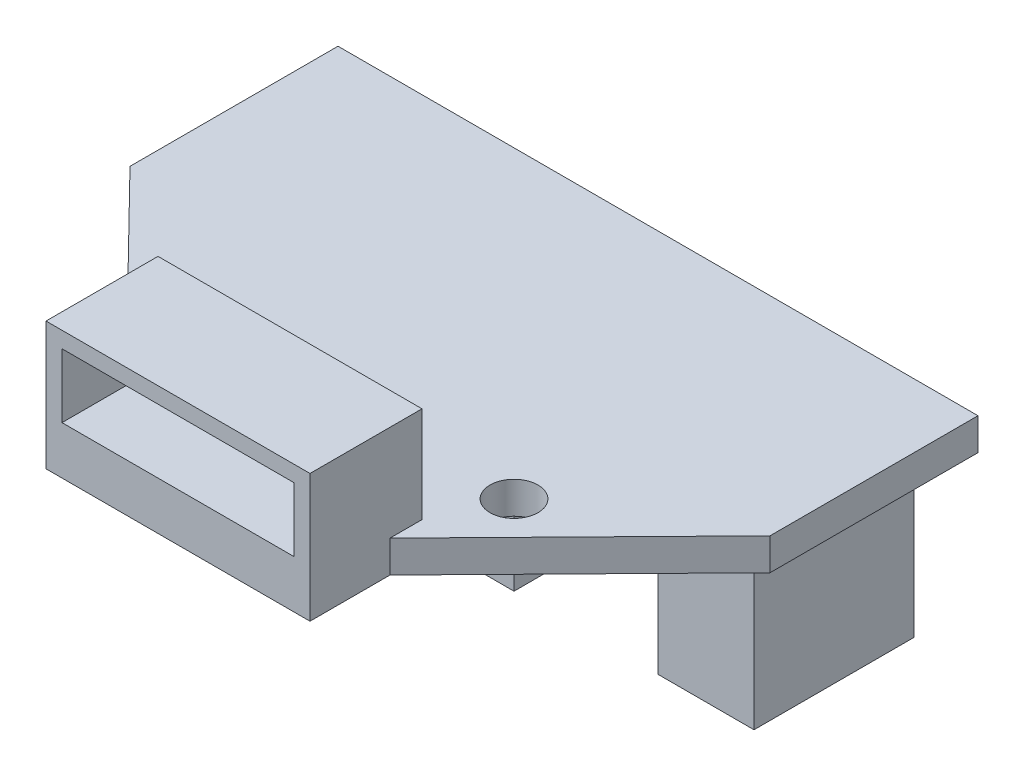
ISO-10303-21;
HEADER;
FILE_DESCRIPTION(('STEP AP214'),'2;1');
FILE_NAME('part.step','',(''),(''),'','','');
FILE_SCHEMA(('AUTOMOTIVE_DESIGN { 1 0 10303 214 1 1 1 1 }'));
ENDSEC;
DATA;
#1=APPLICATION_CONTEXT('core data for automotive mechanical design processes');
#2=APPLICATION_PROTOCOL_DEFINITION('international standard','automotive_design',2000,#1);
#3=PRODUCT_CONTEXT('',#1,'mechanical');
#4=PRODUCT('Part','Part','',(#3));
#5=PRODUCT_RELATED_PRODUCT_CATEGORY('part','',(#4));
#6=PRODUCT_DEFINITION_FORMATION('','',#4);
#7=PRODUCT_DEFINITION_CONTEXT('part definition',#1,'design');
#8=PRODUCT_DEFINITION('design','',#6,#7);
#9=PRODUCT_DEFINITION_SHAPE('','',#8);
#10=(LENGTH_UNIT() NAMED_UNIT(*) SI_UNIT(.MILLI.,.METRE.));
#11=(NAMED_UNIT(*) PLANE_ANGLE_UNIT() SI_UNIT($,.RADIAN.));
#12=(NAMED_UNIT(*) SI_UNIT($,.STERADIAN.) SOLID_ANGLE_UNIT());
#13=UNCERTAINTY_MEASURE_WITH_UNIT(LENGTH_MEASURE(1.E-05),#10,'distance_accuracy_value','');
#14=(GEOMETRIC_REPRESENTATION_CONTEXT(3) GLOBAL_UNCERTAINTY_ASSIGNED_CONTEXT((#13)) GLOBAL_UNIT_ASSIGNED_CONTEXT((#10,
#11,#12)) REPRESENTATION_CONTEXT('',''));
#15=CARTESIAN_POINT('',(0.,0.,0.));
#16=DIRECTION('',(0.,0.,1.));
#17=DIRECTION('',(1.,0.,0.));
#18=AXIS2_PLACEMENT_3D('',#15,#16,#17);
#19=CARTESIAN_POINT('',(0.,0.,0.));
#20=DIRECTION('',(0.,-1.,0.));
#21=DIRECTION('',(0.,0.,-1.));
#22=AXIS2_PLACEMENT_3D('',#19,#20,#21);
#23=PLANE('',#22);
#24=CARTESIAN_POINT('',(-10.,0.,4.));
#25=DIRECTION('',(0.,1.,0.));
#26=DIRECTION('',(0.,0.,1.));
#27=AXIS2_PLACEMENT_3D('',#24,#25,#26);
#28=CIRCLE('',#27,1.5);
#29=CARTESIAN_POINT('',(-10.,0.,5.5));
#30=VERTEX_POINT('',#29);
#31=EDGE_CURVE('E421',#30,#30,#28,.T.);
#32=ORIENTED_EDGE('',*,*,#31,.T.);
#33=EDGE_LOOP('',(#32));
#34=FACE_BOUND('',#33,.T.);
#35=DIRECTION('',(0.,0.,1.));
#36=VECTOR('',#35,1.);
#37=CARTESIAN_POINT('',(-20.,0.,-1.99999999999999));
#38=LINE('',#37,#36);
#39=CARTESIAN_POINT('',(-20.,0.,-15.));
#40=VERTEX_POINT('',#39);
#41=CARTESIAN_POINT('',(-20.,0.,-1.99999999999999));
#42=VERTEX_POINT('',#41);
#43=EDGE_CURVE('E429',#40,#42,#38,.T.);
#44=ORIENTED_EDGE('',*,*,#43,.F.);
#45=DIRECTION('',(-1.,0.,0.));
#46=VECTOR('',#45,1.);
#47=CARTESIAN_POINT('',(-20.,0.,-15.));
#48=LINE('',#47,#46);
#49=CARTESIAN_POINT('',(20.,0.,-15.));
#50=VERTEX_POINT('',#49);
#51=EDGE_CURVE('E438',#50,#40,#48,.T.);
#52=ORIENTED_EDGE('',*,*,#51,.F.);
#53=DIRECTION('',(0.,0.,-1.));
#54=VECTOR('',#53,1.);
#55=CARTESIAN_POINT('',(20.,0.,-15.));
#56=LINE('',#55,#54);
#57=CARTESIAN_POINT('',(20.,0.,-1.99999999999999));
#58=VERTEX_POINT('',#57);
#59=EDGE_CURVE('E469',#58,#50,#56,.T.);
#60=ORIENTED_EDGE('',*,*,#59,.F.);
#61=DIRECTION('',(0.699624792608213,0.,-0.714510426493494));
#62=VECTOR('',#61,1.);
#63=CARTESIAN_POINT('',(20.,0.,-1.99999999999999));
#64=LINE('',#63,#62);
#65=CARTESIAN_POINT('',(8.25,0.,10.));
#66=VERTEX_POINT('',#65);
#67=EDGE_CURVE('E466',#66,#58,#64,.T.);
#68=ORIENTED_EDGE('',*,*,#67,.F.);
#69=DIRECTION('',(0.,0.,-1.));
#70=VECTOR('',#69,1.);
#71=CARTESIAN_POINT('',(8.25,0.,10.));
#72=LINE('',#71,#70);
#73=CARTESIAN_POINT('',(8.25,0.,15.));
#74=VERTEX_POINT('',#73);
#75=EDGE_CURVE('E463',#74,#66,#72,.T.);
#76=ORIENTED_EDGE('',*,*,#75,.F.);
#77=DIRECTION('',(1.,0.,0.));
#78=VECTOR('',#77,1.);
#79=CARTESIAN_POINT('',(8.25,0.,15.));
#80=LINE('',#79,#78);
#81=CARTESIAN_POINT('',(-8.25,0.,15.));
#82=VERTEX_POINT('',#81);
#83=EDGE_CURVE('E460',#82,#74,#80,.T.);
#84=ORIENTED_EDGE('',*,*,#83,.F.);
#85=DIRECTION('',(0.,0.,1.));
#86=VECTOR('',#85,1.);
#87=CARTESIAN_POINT('',(-8.25,0.,10.));
#88=LINE('',#87,#86);
#89=CARTESIAN_POINT('',(-8.25,0.,10.));
#90=VERTEX_POINT('',#89);
#91=EDGE_CURVE('E457',#90,#82,#88,.T.);
#92=ORIENTED_EDGE('',*,*,#91,.F.);
#93=DIRECTION('',(0.699624792608214,0.,0.714510426493494));
#94=VECTOR('',#93,1.);
#95=CARTESIAN_POINT('',(-20.,0.,-1.99999999999999));
#96=LINE('',#95,#94);
#97=EDGE_CURVE('E454',#42,#90,#96,.T.);
#98=ORIENTED_EDGE('',*,*,#97,.F.);
#99=EDGE_LOOP('',(#44,#52,#60,#68,#76,#84,#92,#98));
#100=FACE_BOUND('',#99,.T.);
#101=CARTESIAN_POINT('',(10.,0.,4.));
#102=DIRECTION('',(0.,1.,0.));
#103=DIRECTION('',(0.,0.,1.));
#104=AXIS2_PLACEMENT_3D('',#101,#102,#103);
#105=CIRCLE('',#104,1.5);
#106=CARTESIAN_POINT('',(10.,0.,5.5));
#107=VERTEX_POINT('',#106);
#108=EDGE_CURVE('E416',#107,#107,#105,.T.);
#109=ORIENTED_EDGE('',*,*,#108,.T.);
#110=EDGE_LOOP('',(#109));
#111=FACE_BOUND('',#110,.T.);
#112=DIRECTION('',(-1.,0.,0.));
#113=VECTOR('',#112,1.);
#114=CARTESIAN_POINT('',(-3.,0.,-2.99999999999998));
#115=LINE('',#114,#113);
#116=CARTESIAN_POINT('',(3.,0.,-2.99999999999998));
#117=VERTEX_POINT('',#116);
#118=CARTESIAN_POINT('',(-3.,0.,-2.99999999999998));
#119=VERTEX_POINT('',#118);
#120=EDGE_CURVE('E364',#117,#119,#115,.T.);
#121=ORIENTED_EDGE('',*,*,#120,.F.);
#122=DIRECTION('',(0.,0.,1.));
#123=VECTOR('',#122,1.);
#124=CARTESIAN_POINT('',(3.,0.,-2.99999999999998));
#125=LINE('',#124,#123);
#126=CARTESIAN_POINT('',(3.00000000000001,0.,-13.));
#127=VERTEX_POINT('',#126);
#128=EDGE_CURVE('E345',#127,#117,#125,.T.);
#129=ORIENTED_EDGE('',*,*,#128,.F.);
#130=DIRECTION('',(1.,0.,0.));
#131=VECTOR('',#130,1.);
#132=CARTESIAN_POINT('',(-3.,0.,-13.));
#133=LINE('',#132,#131);
#134=CARTESIAN_POINT('',(-3.,0.,-13.));
#135=VERTEX_POINT('',#134);
#136=EDGE_CURVE('E351',#135,#127,#133,.T.);
#137=ORIENTED_EDGE('',*,*,#136,.F.);
#138=DIRECTION('',(0.,0.,-1.));
#139=VECTOR('',#138,1.);
#140=CARTESIAN_POINT('',(-3.,0.,-2.99999999999998));
#141=LINE('',#140,#139);
#142=EDGE_CURVE('E367',#119,#135,#141,.T.);
#143=ORIENTED_EDGE('',*,*,#142,.F.);
#144=EDGE_LOOP('',(#121,#129,#137,#143));
#145=FACE_BOUND('',#144,.T.);
#146=DIRECTION('',(-1.,0.,0.));
#147=VECTOR('',#146,1.);
#148=CARTESIAN_POINT('',(12.,0.,-2.99999999999998));
#149=LINE('',#148,#147);
#150=CARTESIAN_POINT('',(18.,0.,-2.99999999999998));
#151=VERTEX_POINT('',#150);
#152=CARTESIAN_POINT('',(12.,0.,-2.99999999999998));
#153=VERTEX_POINT('',#152);
#154=EDGE_CURVE('E323',#151,#153,#149,.T.);
#155=ORIENTED_EDGE('',*,*,#154,.F.);
#156=DIRECTION('',(0.,0.,1.));
#157=VECTOR('',#156,1.);
#158=CARTESIAN_POINT('',(18.,0.,-2.99999999999998));
#159=LINE('',#158,#157);
#160=CARTESIAN_POINT('',(18.,0.,-13.));
#161=VERTEX_POINT('',#160);
#162=EDGE_CURVE('E304',#161,#151,#159,.T.);
#163=ORIENTED_EDGE('',*,*,#162,.F.);
#164=DIRECTION('',(1.,0.,0.));
#165=VECTOR('',#164,1.);
#166=CARTESIAN_POINT('',(12.,0.,-13.));
#167=LINE('',#166,#165);
#168=CARTESIAN_POINT('',(12.,0.,-13.));
#169=VERTEX_POINT('',#168);
#170=EDGE_CURVE('E310',#169,#161,#167,.T.);
#171=ORIENTED_EDGE('',*,*,#170,.F.);
#172=DIRECTION('',(0.,0.,-1.));
#173=VECTOR('',#172,1.);
#174=CARTESIAN_POINT('',(12.,0.,-2.99999999999998));
#175=LINE('',#174,#173);
#176=EDGE_CURVE('E326',#153,#169,#175,.T.);
#177=ORIENTED_EDGE('',*,*,#176,.F.);
#178=EDGE_LOOP('',(#155,#163,#171,#177));
#179=FACE_BOUND('',#178,.T.);
#180=DIRECTION('',(-1.,0.,0.));
#181=VECTOR('',#180,1.);
#182=CARTESIAN_POINT('',(-18.,0.,-2.99999999999998));
#183=LINE('',#182,#181);
#184=CARTESIAN_POINT('',(-12.,0.,-2.99999999999998));
#185=VERTEX_POINT('',#184);
#186=CARTESIAN_POINT('',(-18.,0.,-2.99999999999998));
#187=VERTEX_POINT('',#186);
#188=EDGE_CURVE('E284',#185,#187,#183,.T.);
#189=ORIENTED_EDGE('',*,*,#188,.F.);
#190=DIRECTION('',(0.,0.,1.));
#191=VECTOR('',#190,1.);
#192=CARTESIAN_POINT('',(-12.,0.,-2.99999999999998));
#193=LINE('',#192,#191);
#194=CARTESIAN_POINT('',(-12.,0.,-13.));
#195=VERTEX_POINT('',#194);
#196=EDGE_CURVE('E260',#195,#185,#193,.T.);
#197=ORIENTED_EDGE('',*,*,#196,.F.);
#198=DIRECTION('',(1.,0.,0.));
#199=VECTOR('',#198,1.);
#200=CARTESIAN_POINT('',(-18.,0.,-13.));
#201=LINE('',#200,#199);
#202=CARTESIAN_POINT('',(-18.,0.,-13.));
#203=VERTEX_POINT('',#202);
#204=EDGE_CURVE('E271',#203,#195,#201,.T.);
#205=ORIENTED_EDGE('',*,*,#204,.F.);
#206=DIRECTION('',(0.,0.,-1.));
#207=VECTOR('',#206,1.);
#208=CARTESIAN_POINT('',(-18.,0.,-2.99999999999998));
#209=LINE('',#208,#207);
#210=EDGE_CURVE('E287',#187,#203,#209,.T.);
#211=ORIENTED_EDGE('',*,*,#210,.F.);
#212=EDGE_LOOP('',(#189,#197,#205,#211));
#213=FACE_BOUND('',#212,.T.);
#214=ADVANCED_FACE('F39',(#34,#100,#111,#145,#179,#213),#23,.T.);
#215=CARTESIAN_POINT('',(0.,2.,0.));
#216=DIRECTION('',(0.,-1.,0.));
#217=DIRECTION('',(0.,0.,-1.));
#218=AXIS2_PLACEMENT_3D('',#215,#216,#217);
#219=PLANE('',#218);
#220=CARTESIAN_POINT('',(10.,2.,4.));
#221=DIRECTION('',(0.,1.,0.));
#222=DIRECTION('',(0.,0.,1.));
#223=AXIS2_PLACEMENT_3D('',#220,#221,#222);
#224=CIRCLE('',#223,1.5);
#225=CARTESIAN_POINT('',(10.,2.,5.5));
#226=VERTEX_POINT('',#225);
#227=EDGE_CURVE('E417',#226,#226,#224,.T.);
#228=ORIENTED_EDGE('',*,*,#227,.F.);
#229=EDGE_LOOP('',(#228));
#230=FACE_BOUND('',#229,.T.);
#231=CARTESIAN_POINT('',(-10.,2.,4.));
#232=DIRECTION('',(0.,1.,0.));
#233=DIRECTION('',(0.,0.,1.));
#234=AXIS2_PLACEMENT_3D('',#231,#232,#233);
#235=CIRCLE('',#234,1.5);
#236=CARTESIAN_POINT('',(-10.,2.,5.5));
#237=VERTEX_POINT('',#236);
#238=EDGE_CURVE('E425',#237,#237,#235,.T.);
#239=ORIENTED_EDGE('',*,*,#238,.F.);
#240=EDGE_LOOP('',(#239));
#241=FACE_BOUND('',#240,.T.);
#242=DIRECTION('',(0.,0.,1.));
#243=VECTOR('',#242,1.);
#244=CARTESIAN_POINT('',(-8.25,2.,15.));
#245=LINE('',#244,#243);
#246=CARTESIAN_POINT('',(-8.25,2.,8.));
#247=VERTEX_POINT('',#246);
#248=CARTESIAN_POINT('',(-8.25,2.,10.));
#249=VERTEX_POINT('',#248);
#250=EDGE_CURVE('E386',#247,#249,#245,.T.);
#251=ORIENTED_EDGE('',*,*,#250,.F.);
#252=DIRECTION('',(-1.,0.,0.));
#253=VECTOR('',#252,1.);
#254=CARTESIAN_POINT('',(-8.25,2.,8.));
#255=LINE('',#254,#253);
#256=CARTESIAN_POINT('',(8.25,2.,8.));
#257=VERTEX_POINT('',#256);
#258=EDGE_CURVE('E392',#257,#247,#255,.T.);
#259=ORIENTED_EDGE('',*,*,#258,.F.);
#260=DIRECTION('',(0.,0.,-1.));
#261=VECTOR('',#260,1.);
#262=CARTESIAN_POINT('',(8.25,2.,15.));
#263=LINE('',#262,#261);
#264=CARTESIAN_POINT('',(8.25,2.,10.));
#265=VERTEX_POINT('',#264);
#266=EDGE_CURVE('E11',#265,#257,#263,.T.);
#267=ORIENTED_EDGE('',*,*,#266,.F.);
#268=DIRECTION('',(0.699624792608213,0.,-0.714510426493494));
#269=VECTOR('',#268,1.);
#270=CARTESIAN_POINT('',(20.,2.,-1.99999999999999));
#271=LINE('',#270,#269);
#272=CARTESIAN_POINT('',(20.,2.,-1.99999999999999));
#273=VERTEX_POINT('',#272);
#274=EDGE_CURVE('E441',#265,#273,#271,.T.);
#275=ORIENTED_EDGE('',*,*,#274,.T.);
#276=DIRECTION('',(0.,0.,-1.));
#277=VECTOR('',#276,1.);
#278=CARTESIAN_POINT('',(20.,2.,-15.));
#279=LINE('',#278,#277);
#280=CARTESIAN_POINT('',(20.,2.,-15.));
#281=VERTEX_POINT('',#280);
#282=EDGE_CURVE('E444',#273,#281,#279,.T.);
#283=ORIENTED_EDGE('',*,*,#282,.T.);
#284=DIRECTION('',(-1.,0.,0.));
#285=VECTOR('',#284,1.);
#286=CARTESIAN_POINT('',(-20.,2.,-15.));
#287=LINE('',#286,#285);
#288=CARTESIAN_POINT('',(-20.,2.,-15.));
#289=VERTEX_POINT('',#288);
#290=EDGE_CURVE('E447',#281,#289,#287,.T.);
#291=ORIENTED_EDGE('',*,*,#290,.T.);
#292=DIRECTION('',(0.,0.,1.));
#293=VECTOR('',#292,1.);
#294=CARTESIAN_POINT('',(-20.,2.,-1.99999999999999));
#295=LINE('',#294,#293);
#296=CARTESIAN_POINT('',(-20.,2.,-1.99999999999999));
#297=VERTEX_POINT('',#296);
#298=EDGE_CURVE('E433',#289,#297,#295,.T.);
#299=ORIENTED_EDGE('',*,*,#298,.T.);
#300=DIRECTION('',(0.699624792608214,0.,0.714510426493494));
#301=VECTOR('',#300,1.);
#302=CARTESIAN_POINT('',(-20.,2.,-1.99999999999999));
#303=LINE('',#302,#301);
#304=EDGE_CURVE('E437',#297,#249,#303,.T.);
#305=ORIENTED_EDGE('',*,*,#304,.T.);
#306=EDGE_LOOP('',(#251,#259,#267,#275,#283,#291,#299,#305));
#307=FACE_BOUND('',#306,.T.);
#308=ADVANCED_FACE('F531',(#230,#241,#307),#219,.F.);
#309=CARTESIAN_POINT('',(-20.,2.,-1.99999999999999));
#310=DIRECTION('',(1.,0.,0.));
#311=DIRECTION('',(0.,0.,-1.));
#312=AXIS2_PLACEMENT_3D('',#309,#310,#311);
#313=PLANE('',#312);
#314=ORIENTED_EDGE('',*,*,#43,.T.);
#315=DIRECTION('',(0.,-1.,0.));
#316=VECTOR('',#315,1.);
#317=CARTESIAN_POINT('',(-20.,2.,-1.99999999999999));
#318=LINE('',#317,#316);
#319=EDGE_CURVE('E43',#297,#42,#318,.T.);
#320=ORIENTED_EDGE('',*,*,#319,.F.);
#321=ORIENTED_EDGE('',*,*,#298,.F.);
#322=DIRECTION('',(0.,-1.,0.));
#323=VECTOR('',#322,1.);
#324=CARTESIAN_POINT('',(-20.,2.,-15.));
#325=LINE('',#324,#323);
#326=EDGE_CURVE('E450',#289,#40,#325,.T.);
#327=ORIENTED_EDGE('',*,*,#326,.T.);
#328=EDGE_LOOP('',(#314,#320,#321,#327));
#329=FACE_BOUND('',#328,.T.);
#330=ADVANCED_FACE('F41',(#329),#313,.F.);
#331=CARTESIAN_POINT('',(-20.,2.,-1.99999999999999));
#332=DIRECTION('',(0.714510426493494,0.,-0.699624792608214));
#333=DIRECTION('',(-0.699624792608214,0.,-0.714510426493494));
#334=AXIS2_PLACEMENT_3D('',#331,#332,#333);
#335=PLANE('',#334);
#336=ORIENTED_EDGE('',*,*,#97,.T.);
#337=DIRECTION('',(0.,-1.,0.));
#338=VECTOR('',#337,1.);
#339=CARTESIAN_POINT('',(-8.25,2.,10.));
#340=LINE('',#339,#338);
#341=EDGE_CURVE('E496',#249,#90,#340,.T.);
#342=ORIENTED_EDGE('',*,*,#341,.F.);
#343=ORIENTED_EDGE('',*,*,#304,.F.);
#344=ORIENTED_EDGE('',*,*,#319,.T.);
#345=EDGE_LOOP('',(#336,#342,#343,#344));
#346=FACE_BOUND('',#345,.T.);
#347=ADVANCED_FACE('F506',(#346),#335,.F.);
#348=CARTESIAN_POINT('',(-8.25,2.,10.));
#349=DIRECTION('',(1.,0.,0.));
#350=DIRECTION('',(0.,0.,-1.));
#351=AXIS2_PLACEMENT_3D('',#348,#349,#350);
#352=PLANE('',#351);
#353=ORIENTED_EDGE('',*,*,#91,.T.);
#354=DIRECTION('',(0.,-1.,0.));
#355=VECTOR('',#354,1.);
#356=CARTESIAN_POINT('',(-8.25,2.,15.));
#357=LINE('',#356,#355);
#358=CARTESIAN_POINT('',(-8.25,8.,15.));
#359=VERTEX_POINT('',#358);
#360=EDGE_CURVE('E493',#359,#82,#357,.T.);
#361=ORIENTED_EDGE('',*,*,#360,.F.);
#362=DIRECTION('',(0.,0.,1.));
#363=VECTOR('',#362,1.);
#364=CARTESIAN_POINT('',(-8.25,8.,15.));
#365=LINE('',#364,#363);
#366=CARTESIAN_POINT('',(-8.25,8.,8.));
#367=VERTEX_POINT('',#366);
#368=EDGE_CURVE('E387',#367,#359,#365,.T.);
#369=ORIENTED_EDGE('',*,*,#368,.F.);
#370=DIRECTION('',(0.,-1.,0.));
#371=VECTOR('',#370,1.);
#372=CARTESIAN_POINT('',(-8.25,8.,8.));
#373=LINE('',#372,#371);
#374=EDGE_CURVE('E402',#367,#247,#373,.T.);
#375=ORIENTED_EDGE('',*,*,#374,.T.);
#376=ORIENTED_EDGE('',*,*,#250,.T.);
#377=ORIENTED_EDGE('',*,*,#341,.T.);
#378=EDGE_LOOP('',(#353,#361,#369,#375,#376,#377));
#379=FACE_BOUND('',#378,.T.);
#380=ADVANCED_FACE('F517',(#379),#352,.F.);
#381=CARTESIAN_POINT('',(8.25,2.,15.));
#382=DIRECTION('',(0.,0.,-1.));
#383=DIRECTION('',(-1.,0.,0.));
#384=AXIS2_PLACEMENT_3D('',#381,#382,#383);
#385=PLANE('',#384);
#386=DIRECTION('',(-1.,0.,0.));
#387=VECTOR('',#386,1.);
#388=CARTESIAN_POINT('',(-7.25,7.,15.));
#389=LINE('',#388,#387);
#390=CARTESIAN_POINT('',(7.25,7.,15.));
#391=VERTEX_POINT('',#390);
#392=CARTESIAN_POINT('',(-7.25,7.,15.));
#393=VERTEX_POINT('',#392);
#394=EDGE_CURVE('E251',#391,#393,#389,.T.);
#395=ORIENTED_EDGE('',*,*,#394,.F.);
#396=DIRECTION('',(0.,1.,0.));
#397=VECTOR('',#396,1.);
#398=CARTESIAN_POINT('',(7.25,3.,15.));
#399=LINE('',#398,#397);
#400=CARTESIAN_POINT('',(7.25,3.,15.));
#401=VERTEX_POINT('',#400);
#402=EDGE_CURVE('E56',#401,#391,#399,.T.);
#403=ORIENTED_EDGE('',*,*,#402,.F.);
#404=DIRECTION('',(1.,0.,0.));
#405=VECTOR('',#404,1.);
#406=CARTESIAN_POINT('',(-7.25,3.,15.));
#407=LINE('',#406,#405);
#408=CARTESIAN_POINT('',(-7.25,3.,15.));
#409=VERTEX_POINT('',#408);
#410=EDGE_CURVE('E238',#409,#401,#407,.T.);
#411=ORIENTED_EDGE('',*,*,#410,.F.);
#412=DIRECTION('',(0.,-1.,0.));
#413=VECTOR('',#412,1.);
#414=CARTESIAN_POINT('',(-7.25,3.,15.));
#415=LINE('',#414,#413);
#416=EDGE_CURVE('E242',#393,#409,#415,.T.);
#417=ORIENTED_EDGE('',*,*,#416,.F.);
#418=EDGE_LOOP('',(#395,#403,#411,#417));
#419=FACE_BOUND('',#418,.T.);
#420=ORIENTED_EDGE('',*,*,#83,.T.);
#421=DIRECTION('',(0.,-1.,0.));
#422=VECTOR('',#421,1.);
#423=CARTESIAN_POINT('',(8.25,2.,15.));
#424=LINE('',#423,#422);
#425=CARTESIAN_POINT('',(8.25,8.,15.));
#426=VERTEX_POINT('',#425);
#427=EDGE_CURVE('E489',#426,#74,#424,.T.);
#428=ORIENTED_EDGE('',*,*,#427,.F.);
#429=DIRECTION('',(1.,0.,0.));
#430=VECTOR('',#429,1.);
#431=CARTESIAN_POINT('',(-8.25,8.,15.));
#432=LINE('',#431,#430);
#433=EDGE_CURVE('E391',#359,#426,#432,.T.);
#434=ORIENTED_EDGE('',*,*,#433,.F.);
#435=ORIENTED_EDGE('',*,*,#360,.T.);
#436=EDGE_LOOP('',(#420,#428,#434,#435));
#437=FACE_BOUND('',#436,.T.);
#438=ADVANCED_FACE('F521',(#419,#437),#385,.F.);
#439=CARTESIAN_POINT('',(8.25,2.,10.));
#440=DIRECTION('',(-1.,0.,0.));
#441=DIRECTION('',(0.,0.,1.));
#442=AXIS2_PLACEMENT_3D('',#439,#440,#441);
#443=PLANE('',#442);
#444=ORIENTED_EDGE('',*,*,#75,.T.);
#445=DIRECTION('',(0.,-1.,0.));
#446=VECTOR('',#445,1.);
#447=CARTESIAN_POINT('',(8.25,2.,10.));
#448=LINE('',#447,#446);
#449=EDGE_CURVE('E485',#265,#66,#448,.T.);
#450=ORIENTED_EDGE('',*,*,#449,.F.);
#451=ORIENTED_EDGE('',*,*,#266,.T.);
#452=DIRECTION('',(0.,-1.,0.));
#453=VECTOR('',#452,1.);
#454=CARTESIAN_POINT('',(8.25,8.,8.));
#455=LINE('',#454,#453);
#456=CARTESIAN_POINT('',(8.25,8.,8.));
#457=VERTEX_POINT('',#456);
#458=EDGE_CURVE('E412',#457,#257,#455,.T.);
#459=ORIENTED_EDGE('',*,*,#458,.F.);
#460=DIRECTION('',(0.,0.,-1.));
#461=VECTOR('',#460,1.);
#462=CARTESIAN_POINT('',(8.25,8.,15.));
#463=LINE('',#462,#461);
#464=EDGE_CURVE('E396',#426,#457,#463,.T.);
#465=ORIENTED_EDGE('',*,*,#464,.F.);
#466=ORIENTED_EDGE('',*,*,#427,.T.);
#467=EDGE_LOOP('',(#444,#450,#451,#459,#465,#466));
#468=FACE_BOUND('',#467,.T.);
#469=ADVANCED_FACE('F534',(#468),#443,.F.);
#470=CARTESIAN_POINT('',(20.,2.,-1.99999999999999));
#471=DIRECTION('',(-0.714510426493494,0.,-0.699624792608213));
#472=DIRECTION('',(-0.699624792608213,0.,0.714510426493494));
#473=AXIS2_PLACEMENT_3D('',#470,#471,#472);
#474=PLANE('',#473);
#475=ORIENTED_EDGE('',*,*,#67,.T.);
#476=DIRECTION('',(0.,-1.,0.));
#477=VECTOR('',#476,1.);
#478=CARTESIAN_POINT('',(20.,2.,-1.99999999999999));
#479=LINE('',#478,#477);
#480=EDGE_CURVE('E481',#273,#58,#479,.T.);
#481=ORIENTED_EDGE('',*,*,#480,.F.);
#482=ORIENTED_EDGE('',*,*,#274,.F.);
#483=ORIENTED_EDGE('',*,*,#449,.T.);
#484=EDGE_LOOP('',(#475,#481,#482,#483));
#485=FACE_BOUND('',#484,.T.);
#486=ADVANCED_FACE('F539',(#485),#474,.F.);
#487=CARTESIAN_POINT('',(20.,2.,-15.));
#488=DIRECTION('',(-1.,0.,0.));
#489=DIRECTION('',(0.,0.,1.));
#490=AXIS2_PLACEMENT_3D('',#487,#488,#489);
#491=PLANE('',#490);
#492=ORIENTED_EDGE('',*,*,#59,.T.);
#493=DIRECTION('',(0.,-1.,0.));
#494=VECTOR('',#493,1.);
#495=CARTESIAN_POINT('',(20.,2.,-15.));
#496=LINE('',#495,#494);
#497=EDGE_CURVE('E477',#281,#50,#496,.T.);
#498=ORIENTED_EDGE('',*,*,#497,.F.);
#499=ORIENTED_EDGE('',*,*,#282,.F.);
#500=ORIENTED_EDGE('',*,*,#480,.T.);
#501=EDGE_LOOP('',(#492,#498,#499,#500));
#502=FACE_BOUND('',#501,.T.);
#503=ADVANCED_FACE('F544',(#502),#491,.F.);
#504=CARTESIAN_POINT('',(-20.,2.,-15.));
#505=DIRECTION('',(0.,0.,1.));
#506=DIRECTION('',(1.,0.,0.));
#507=AXIS2_PLACEMENT_3D('',#504,#505,#506);
#508=PLANE('',#507);
#509=ORIENTED_EDGE('',*,*,#51,.T.);
#510=ORIENTED_EDGE('',*,*,#326,.F.);
#511=ORIENTED_EDGE('',*,*,#290,.F.);
#512=ORIENTED_EDGE('',*,*,#497,.T.);
#513=EDGE_LOOP('',(#509,#510,#511,#512));
#514=FACE_BOUND('',#513,.T.);
#515=ADVANCED_FACE('F546',(#514),#508,.F.);
#516=CARTESIAN_POINT('',(-10.,2.,4.));
#517=DIRECTION('',(0.,-1.,0.));
#518=DIRECTION('',(0.,0.,-1.));
#519=AXIS2_PLACEMENT_3D('',#516,#517,#518);
#520=CYLINDRICAL_SURFACE('',#519,1.5);
#521=ORIENTED_EDGE('',*,*,#238,.T.);
#522=EDGE_LOOP('',(#521));
#523=FACE_BOUND('',#522,.T.);
#524=ORIENTED_EDGE('',*,*,#31,.F.);
#525=EDGE_LOOP('',(#524));
#526=FACE_BOUND('',#525,.T.);
#527=ADVANCED_FACE('F548',(#523,#526),#520,.F.);
#528=CARTESIAN_POINT('',(10.,2.,4.));
#529=DIRECTION('',(0.,-1.,0.));
#530=DIRECTION('',(0.,0.,-1.));
#531=AXIS2_PLACEMENT_3D('',#528,#529,#530);
#532=CYLINDRICAL_SURFACE('',#531,1.5);
#533=ORIENTED_EDGE('',*,*,#227,.T.);
#534=EDGE_LOOP('',(#533));
#535=FACE_BOUND('',#534,.T.);
#536=ORIENTED_EDGE('',*,*,#108,.F.);
#537=EDGE_LOOP('',(#536));
#538=FACE_BOUND('',#537,.T.);
#539=ADVANCED_FACE('F554',(#535,#538),#532,.F.);
#540=CARTESIAN_POINT('',(-8.25,8.,8.));
#541=DIRECTION('',(0.,0.,1.));
#542=DIRECTION('',(1.,0.,0.));
#543=AXIS2_PLACEMENT_3D('',#540,#541,#542);
#544=PLANE('',#543);
#545=ORIENTED_EDGE('',*,*,#258,.T.);
#546=ORIENTED_EDGE('',*,*,#374,.F.);
#547=DIRECTION('',(-1.,0.,0.));
#548=VECTOR('',#547,1.);
#549=CARTESIAN_POINT('',(-8.25,8.,8.));
#550=LINE('',#549,#548);
#551=EDGE_CURVE('E399',#457,#367,#550,.T.);
#552=ORIENTED_EDGE('',*,*,#551,.F.);
#553=ORIENTED_EDGE('',*,*,#458,.T.);
#554=EDGE_LOOP('',(#545,#546,#552,#553));
#555=FACE_BOUND('',#554,.T.);
#556=ADVANCED_FACE('F528',(#555),#544,.F.);
#557=CARTESIAN_POINT('',(0.,8.,0.));
#558=DIRECTION('',(0.,-1.,0.));
#559=DIRECTION('',(0.,0.,-1.));
#560=AXIS2_PLACEMENT_3D('',#557,#558,#559);
#561=PLANE('',#560);
#562=ORIENTED_EDGE('',*,*,#368,.T.);
#563=ORIENTED_EDGE('',*,*,#433,.T.);
#564=ORIENTED_EDGE('',*,*,#464,.T.);
#565=ORIENTED_EDGE('',*,*,#551,.T.);
#566=EDGE_LOOP('',(#562,#563,#564,#565));
#567=FACE_BOUND('',#566,.T.);
#568=ADVANCED_FACE('F524',(#567),#561,.F.);
#569=CARTESIAN_POINT('',(3.,-10.,-2.99999999999998));
#570=DIRECTION('',(-1.,0.,0.));
#571=DIRECTION('',(0.,0.,1.));
#572=AXIS2_PLACEMENT_3D('',#569,#570,#571);
#573=PLANE('',#572);
#574=ORIENTED_EDGE('',*,*,#128,.T.);
#575=DIRECTION('',(0.,1.,0.));
#576=VECTOR('',#575,1.);
#577=CARTESIAN_POINT('',(3.,-10.,-2.99999999999998));
#578=LINE('',#577,#576);
#579=CARTESIAN_POINT('',(3.,-10.,-2.99999999999998));
#580=VERTEX_POINT('',#579);
#581=EDGE_CURVE('E383',#580,#117,#578,.T.);
#582=ORIENTED_EDGE('',*,*,#581,.F.);
#583=DIRECTION('',(0.,0.,1.));
#584=VECTOR('',#583,1.);
#585=CARTESIAN_POINT('',(3.,-10.,-2.99999999999998));
#586=LINE('',#585,#584);
#587=CARTESIAN_POINT('',(3.00000000000001,-10.,-13.));
#588=VERTEX_POINT('',#587);
#589=EDGE_CURVE('E346',#588,#580,#586,.T.);
#590=ORIENTED_EDGE('',*,*,#589,.F.);
#591=DIRECTION('',(0.,1.,0.));
#592=VECTOR('',#591,1.);
#593=CARTESIAN_POINT('',(3.00000000000001,-10.,-13.));
#594=LINE('',#593,#592);
#595=EDGE_CURVE('E360',#588,#127,#594,.T.);
#596=ORIENTED_EDGE('',*,*,#595,.T.);
#597=EDGE_LOOP('',(#574,#582,#590,#596));
#598=FACE_BOUND('',#597,.T.);
#599=ADVANCED_FACE('F574',(#598),#573,.F.);
#600=CARTESIAN_POINT('',(-3.,-10.,-2.99999999999998));
#601=DIRECTION('',(0.,0.,-1.));
#602=DIRECTION('',(-1.,0.,0.));
#603=AXIS2_PLACEMENT_3D('',#600,#601,#602);
#604=PLANE('',#603);
#605=ORIENTED_EDGE('',*,*,#120,.T.);
#606=DIRECTION('',(0.,1.,0.));
#607=VECTOR('',#606,1.);
#608=CARTESIAN_POINT('',(-3.,-10.,-2.99999999999998));
#609=LINE('',#608,#607);
#610=CARTESIAN_POINT('',(-3.,-10.,-2.99999999999998));
#611=VERTEX_POINT('',#610);
#612=EDGE_CURVE('E379',#611,#119,#609,.T.);
#613=ORIENTED_EDGE('',*,*,#612,.F.);
#614=DIRECTION('',(-1.,0.,0.));
#615=VECTOR('',#614,1.);
#616=CARTESIAN_POINT('',(-3.,-10.,-2.99999999999998));
#617=LINE('',#616,#615);
#618=EDGE_CURVE('E350',#580,#611,#617,.T.);
#619=ORIENTED_EDGE('',*,*,#618,.F.);
#620=ORIENTED_EDGE('',*,*,#581,.T.);
#621=EDGE_LOOP('',(#605,#613,#619,#620));
#622=FACE_BOUND('',#621,.T.);
#623=ADVANCED_FACE('F577',(#622),#604,.F.);
#624=CARTESIAN_POINT('',(-3.,-10.,-2.99999999999998));
#625=DIRECTION('',(1.,0.,0.));
#626=DIRECTION('',(0.,0.,-1.));
#627=AXIS2_PLACEMENT_3D('',#624,#625,#626);
#628=PLANE('',#627);
#629=ORIENTED_EDGE('',*,*,#142,.T.);
#630=DIRECTION('',(0.,1.,0.));
#631=VECTOR('',#630,1.);
#632=CARTESIAN_POINT('',(-3.,-10.,-13.));
#633=LINE('',#632,#631);
#634=CARTESIAN_POINT('',(-3.,-10.,-13.));
#635=VERTEX_POINT('',#634);
#636=EDGE_CURVE('E376',#635,#135,#633,.T.);
#637=ORIENTED_EDGE('',*,*,#636,.F.);
#638=DIRECTION('',(0.,0.,-1.));
#639=VECTOR('',#638,1.);
#640=CARTESIAN_POINT('',(-3.,-10.,-2.99999999999998));
#641=LINE('',#640,#639);
#642=EDGE_CURVE('E354',#611,#635,#641,.T.);
#643=ORIENTED_EDGE('',*,*,#642,.F.);
#644=ORIENTED_EDGE('',*,*,#612,.T.);
#645=EDGE_LOOP('',(#629,#637,#643,#644));
#646=FACE_BOUND('',#645,.T.);
#647=ADVANCED_FACE('F581',(#646),#628,.F.);
#648=CARTESIAN_POINT('',(-3.,-10.,-13.));
#649=DIRECTION('',(0.,0.,1.));
#650=DIRECTION('',(1.,0.,0.));
#651=AXIS2_PLACEMENT_3D('',#648,#649,#650);
#652=PLANE('',#651);
#653=ORIENTED_EDGE('',*,*,#136,.T.);
#654=ORIENTED_EDGE('',*,*,#595,.F.);
#655=DIRECTION('',(1.,0.,0.));
#656=VECTOR('',#655,1.);
#657=CARTESIAN_POINT('',(-3.,-10.,-13.));
#658=LINE('',#657,#656);
#659=EDGE_CURVE('E357',#635,#588,#658,.T.);
#660=ORIENTED_EDGE('',*,*,#659,.F.);
#661=ORIENTED_EDGE('',*,*,#636,.T.);
#662=EDGE_LOOP('',(#653,#654,#660,#661));
#663=FACE_BOUND('',#662,.T.);
#664=ADVANCED_FACE('F585',(#663),#652,.F.);
#665=CARTESIAN_POINT('',(0.,-10.,0.));
#666=DIRECTION('',(0.,-1.,0.));
#667=DIRECTION('',(0.,0.,-1.));
#668=AXIS2_PLACEMENT_3D('',#665,#666,#667);
#669=PLANE('',#668);
#670=ORIENTED_EDGE('',*,*,#589,.T.);
#671=ORIENTED_EDGE('',*,*,#618,.T.);
#672=ORIENTED_EDGE('',*,*,#642,.T.);
#673=ORIENTED_EDGE('',*,*,#659,.T.);
#674=EDGE_LOOP('',(#670,#671,#672,#673));
#675=FACE_BOUND('',#674,.T.);
#676=ADVANCED_FACE('F589',(#675),#669,.T.);
#677=CARTESIAN_POINT('',(18.,-10.,-2.99999999999998));
#678=DIRECTION('',(-1.,0.,0.));
#679=DIRECTION('',(0.,0.,1.));
#680=AXIS2_PLACEMENT_3D('',#677,#678,#679);
#681=PLANE('',#680);
#682=ORIENTED_EDGE('',*,*,#162,.T.);
#683=DIRECTION('',(0.,1.,0.));
#684=VECTOR('',#683,1.);
#685=CARTESIAN_POINT('',(18.,-10.,-2.99999999999998));
#686=LINE('',#685,#684);
#687=CARTESIAN_POINT('',(18.,-10.,-2.99999999999998));
#688=VERTEX_POINT('',#687);
#689=EDGE_CURVE('E342',#688,#151,#686,.T.);
#690=ORIENTED_EDGE('',*,*,#689,.F.);
#691=DIRECTION('',(0.,0.,1.));
#692=VECTOR('',#691,1.);
#693=CARTESIAN_POINT('',(18.,-10.,-2.99999999999998));
#694=LINE('',#693,#692);
#695=CARTESIAN_POINT('',(18.,-10.,-13.));
#696=VERTEX_POINT('',#695);
#697=EDGE_CURVE('E305',#696,#688,#694,.T.);
#698=ORIENTED_EDGE('',*,*,#697,.F.);
#699=DIRECTION('',(0.,1.,0.));
#700=VECTOR('',#699,1.);
#701=CARTESIAN_POINT('',(18.,-10.,-13.));
#702=LINE('',#701,#700);
#703=EDGE_CURVE('E319',#696,#161,#702,.T.);
#704=ORIENTED_EDGE('',*,*,#703,.T.);
#705=EDGE_LOOP('',(#682,#690,#698,#704));
#706=FACE_BOUND('',#705,.T.);
#707=ADVANCED_FACE('F593',(#706),#681,.F.);
#708=CARTESIAN_POINT('',(12.,-10.,-2.99999999999998));
#709=DIRECTION('',(0.,0.,-1.));
#710=DIRECTION('',(-1.,0.,0.));
#711=AXIS2_PLACEMENT_3D('',#708,#709,#710);
#712=PLANE('',#711);
#713=ORIENTED_EDGE('',*,*,#154,.T.);
#714=DIRECTION('',(0.,1.,0.));
#715=VECTOR('',#714,1.);
#716=CARTESIAN_POINT('',(12.,-10.,-2.99999999999998));
#717=LINE('',#716,#715);
#718=CARTESIAN_POINT('',(12.,-10.,-2.99999999999998));
#719=VERTEX_POINT('',#718);
#720=EDGE_CURVE('E338',#719,#153,#717,.T.);
#721=ORIENTED_EDGE('',*,*,#720,.F.);
#722=DIRECTION('',(-1.,0.,0.));
#723=VECTOR('',#722,1.);
#724=CARTESIAN_POINT('',(12.,-10.,-2.99999999999998));
#725=LINE('',#724,#723);
#726=EDGE_CURVE('E309',#688,#719,#725,.T.);
#727=ORIENTED_EDGE('',*,*,#726,.F.);
#728=ORIENTED_EDGE('',*,*,#689,.T.);
#729=EDGE_LOOP('',(#713,#721,#727,#728));
#730=FACE_BOUND('',#729,.T.);
#731=ADVANCED_FACE('F597',(#730),#712,.F.);
#732=CARTESIAN_POINT('',(12.,-10.,-2.99999999999998));
#733=DIRECTION('',(1.,0.,0.));
#734=DIRECTION('',(0.,0.,-1.));
#735=AXIS2_PLACEMENT_3D('',#732,#733,#734);
#736=PLANE('',#735);
#737=ORIENTED_EDGE('',*,*,#176,.T.);
#738=DIRECTION('',(0.,1.,0.));
#739=VECTOR('',#738,1.);
#740=CARTESIAN_POINT('',(12.,-10.,-13.));
#741=LINE('',#740,#739);
#742=CARTESIAN_POINT('',(12.,-10.,-13.));
#743=VERTEX_POINT('',#742);
#744=EDGE_CURVE('E335',#743,#169,#741,.T.);
#745=ORIENTED_EDGE('',*,*,#744,.F.);
#746=DIRECTION('',(0.,0.,-1.));
#747=VECTOR('',#746,1.);
#748=CARTESIAN_POINT('',(12.,-10.,-2.99999999999998));
#749=LINE('',#748,#747);
#750=EDGE_CURVE('E313',#719,#743,#749,.T.);
#751=ORIENTED_EDGE('',*,*,#750,.F.);
#752=ORIENTED_EDGE('',*,*,#720,.T.);
#753=EDGE_LOOP('',(#737,#745,#751,#752));
#754=FACE_BOUND('',#753,.T.);
#755=ADVANCED_FACE('F601',(#754),#736,.F.);
#756=CARTESIAN_POINT('',(12.,-10.,-13.));
#757=DIRECTION('',(0.,0.,1.));
#758=DIRECTION('',(1.,0.,0.));
#759=AXIS2_PLACEMENT_3D('',#756,#757,#758);
#760=PLANE('',#759);
#761=ORIENTED_EDGE('',*,*,#170,.T.);
#762=ORIENTED_EDGE('',*,*,#703,.F.);
#763=DIRECTION('',(1.,0.,0.));
#764=VECTOR('',#763,1.);
#765=CARTESIAN_POINT('',(12.,-10.,-13.));
#766=LINE('',#765,#764);
#767=EDGE_CURVE('E316',#743,#696,#766,.T.);
#768=ORIENTED_EDGE('',*,*,#767,.F.);
#769=ORIENTED_EDGE('',*,*,#744,.T.);
#770=EDGE_LOOP('',(#761,#762,#768,#769));
#771=FACE_BOUND('',#770,.T.);
#772=ADVANCED_FACE('F605',(#771),#760,.F.);
#773=CARTESIAN_POINT('',(15.,-10.,0.));
#774=DIRECTION('',(0.,-1.,0.));
#775=DIRECTION('',(0.,0.,-1.));
#776=AXIS2_PLACEMENT_3D('',#773,#774,#775);
#777=PLANE('',#776);
#778=ORIENTED_EDGE('',*,*,#697,.T.);
#779=ORIENTED_EDGE('',*,*,#726,.T.);
#780=ORIENTED_EDGE('',*,*,#750,.T.);
#781=ORIENTED_EDGE('',*,*,#767,.T.);
#782=EDGE_LOOP('',(#778,#779,#780,#781));
#783=FACE_BOUND('',#782,.T.);
#784=ADVANCED_FACE('F609',(#783),#777,.T.);
#785=CARTESIAN_POINT('',(-12.,-10.,-2.99999999999998));
#786=DIRECTION('',(-1.,0.,0.));
#787=DIRECTION('',(0.,0.,1.));
#788=AXIS2_PLACEMENT_3D('',#785,#786,#787);
#789=PLANE('',#788);
#790=ORIENTED_EDGE('',*,*,#196,.T.);
#791=DIRECTION('',(0.,1.,0.));
#792=VECTOR('',#791,1.);
#793=CARTESIAN_POINT('',(-12.,-10.,-2.99999999999998));
#794=LINE('',#793,#792);
#795=CARTESIAN_POINT('',(-12.,-10.,-2.99999999999998));
#796=VERTEX_POINT('',#795);
#797=EDGE_CURVE('E301',#796,#185,#794,.T.);
#798=ORIENTED_EDGE('',*,*,#797,.F.);
#799=DIRECTION('',(0.,0.,1.));
#800=VECTOR('',#799,1.);
#801=CARTESIAN_POINT('',(-12.,-10.,-2.99999999999998));
#802=LINE('',#801,#800);
#803=CARTESIAN_POINT('',(-12.,-10.,-13.));
#804=VERTEX_POINT('',#803);
#805=EDGE_CURVE('E266',#804,#796,#802,.T.);
#806=ORIENTED_EDGE('',*,*,#805,.F.);
#807=DIRECTION('',(0.,1.,0.));
#808=VECTOR('',#807,1.);
#809=CARTESIAN_POINT('',(-12.,-10.,-13.));
#810=LINE('',#809,#808);
#811=EDGE_CURVE('E280',#804,#195,#810,.T.);
#812=ORIENTED_EDGE('',*,*,#811,.T.);
#813=EDGE_LOOP('',(#790,#798,#806,#812));
#814=FACE_BOUND('',#813,.T.);
#815=ADVANCED_FACE('F613',(#814),#789,.F.);
#816=CARTESIAN_POINT('',(-18.,-10.,-2.99999999999998));
#817=DIRECTION('',(0.,0.,-1.));
#818=DIRECTION('',(-1.,0.,0.));
#819=AXIS2_PLACEMENT_3D('',#816,#817,#818);
#820=PLANE('',#819);
#821=ORIENTED_EDGE('',*,*,#188,.T.);
#822=DIRECTION('',(0.,1.,0.));
#823=VECTOR('',#822,1.);
#824=CARTESIAN_POINT('',(-18.,-10.,-2.99999999999998));
#825=LINE('',#824,#823);
#826=CARTESIAN_POINT('',(-18.,-10.,-2.99999999999998));
#827=VERTEX_POINT('',#826);
#828=EDGE_CURVE('E297',#827,#187,#825,.T.);
#829=ORIENTED_EDGE('',*,*,#828,.F.);
#830=DIRECTION('',(-1.,0.,0.));
#831=VECTOR('',#830,1.);
#832=CARTESIAN_POINT('',(-18.,-10.,-2.99999999999998));
#833=LINE('',#832,#831);
#834=EDGE_CURVE('E270',#796,#827,#833,.T.);
#835=ORIENTED_EDGE('',*,*,#834,.F.);
#836=ORIENTED_EDGE('',*,*,#797,.T.);
#837=EDGE_LOOP('',(#821,#829,#835,#836));
#838=FACE_BOUND('',#837,.T.);
#839=ADVANCED_FACE('F617',(#838),#820,.F.);
#840=CARTESIAN_POINT('',(-18.,-10.,-2.99999999999998));
#841=DIRECTION('',(1.,0.,0.));
#842=DIRECTION('',(0.,0.,-1.));
#843=AXIS2_PLACEMENT_3D('',#840,#841,#842);
#844=PLANE('',#843);
#845=ORIENTED_EDGE('',*,*,#210,.T.);
#846=DIRECTION('',(0.,1.,0.));
#847=VECTOR('',#846,1.);
#848=CARTESIAN_POINT('',(-18.,-10.,-13.));
#849=LINE('',#848,#847);
#850=CARTESIAN_POINT('',(-18.,-10.,-13.));
#851=VERTEX_POINT('',#850);
#852=EDGE_CURVE('E64',#851,#203,#849,.T.);
#853=ORIENTED_EDGE('',*,*,#852,.F.);
#854=DIRECTION('',(0.,0.,-1.));
#855=VECTOR('',#854,1.);
#856=CARTESIAN_POINT('',(-18.,-10.,-2.99999999999998));
#857=LINE('',#856,#855);
#858=EDGE_CURVE('E274',#827,#851,#857,.T.);
#859=ORIENTED_EDGE('',*,*,#858,.F.);
#860=ORIENTED_EDGE('',*,*,#828,.T.);
#861=EDGE_LOOP('',(#845,#853,#859,#860));
#862=FACE_BOUND('',#861,.T.);
#863=ADVANCED_FACE('F621',(#862),#844,.F.);
#864=CARTESIAN_POINT('',(-18.,-10.,-13.));
#865=DIRECTION('',(0.,0.,1.));
#866=DIRECTION('',(1.,0.,0.));
#867=AXIS2_PLACEMENT_3D('',#864,#865,#866);
#868=PLANE('',#867);
#869=ORIENTED_EDGE('',*,*,#204,.T.);
#870=ORIENTED_EDGE('',*,*,#811,.F.);
#871=DIRECTION('',(1.,0.,0.));
#872=VECTOR('',#871,1.);
#873=CARTESIAN_POINT('',(-18.,-10.,-13.));
#874=LINE('',#873,#872);
#875=EDGE_CURVE('E277',#851,#804,#874,.T.);
#876=ORIENTED_EDGE('',*,*,#875,.F.);
#877=ORIENTED_EDGE('',*,*,#852,.T.);
#878=EDGE_LOOP('',(#869,#870,#876,#877));
#879=FACE_BOUND('',#878,.T.);
#880=ADVANCED_FACE('F625',(#879),#868,.F.);
#881=CARTESIAN_POINT('',(-15.,-10.,0.));
#882=DIRECTION('',(0.,-1.,0.));
#883=DIRECTION('',(0.,0.,-1.));
#884=AXIS2_PLACEMENT_3D('',#881,#882,#883);
#885=PLANE('',#884);
#886=ORIENTED_EDGE('',*,*,#805,.T.);
#887=ORIENTED_EDGE('',*,*,#834,.T.);
#888=ORIENTED_EDGE('',*,*,#858,.T.);
#889=ORIENTED_EDGE('',*,*,#875,.T.);
#890=EDGE_LOOP('',(#886,#887,#888,#889));
#891=FACE_BOUND('',#890,.T.);
#892=ADVANCED_FACE('F629',(#891),#885,.T.);
#893=CARTESIAN_POINT('',(7.25,3.,10.));
#894=DIRECTION('',(1.,0.,0.));
#895=DIRECTION('',(0.,0.,-1.));
#896=AXIS2_PLACEMENT_3D('',#893,#894,#895);
#897=PLANE('',#896);
#898=ORIENTED_EDGE('',*,*,#402,.T.);
#899=DIRECTION('',(0.,0.,1.));
#900=VECTOR('',#899,1.);
#901=CARTESIAN_POINT('',(7.25,7.,10.));
#902=LINE('',#901,#900);
#903=CARTESIAN_POINT('',(7.25,7.,10.));
#904=VERTEX_POINT('',#903);
#905=EDGE_CURVE('E213',#904,#391,#902,.T.);
#906=ORIENTED_EDGE('',*,*,#905,.F.);
#907=DIRECTION('',(0.,1.,0.));
#908=VECTOR('',#907,1.);
#909=CARTESIAN_POINT('',(7.25,3.,10.));
#910=LINE('',#909,#908);
#911=CARTESIAN_POINT('',(7.25,3.,10.));
#912=VERTEX_POINT('',#911);
#913=EDGE_CURVE('E217',#912,#904,#910,.T.);
#914=ORIENTED_EDGE('',*,*,#913,.F.);
#915=DIRECTION('',(0.,0.,1.));
#916=VECTOR('',#915,1.);
#917=CARTESIAN_POINT('',(7.25,3.,10.));
#918=LINE('',#917,#916);
#919=EDGE_CURVE('E257',#912,#401,#918,.T.);
#920=ORIENTED_EDGE('',*,*,#919,.T.);
#921=EDGE_LOOP('',(#898,#906,#914,#920));
#922=FACE_BOUND('',#921,.T.);
#923=ADVANCED_FACE('F215',(#922),#897,.F.);
#924=CARTESIAN_POINT('',(-7.25,3.,10.));
#925=DIRECTION('',(0.,-1.,0.));
#926=DIRECTION('',(0.,0.,-1.));
#927=AXIS2_PLACEMENT_3D('',#924,#925,#926);
#928=PLANE('',#927);
#929=ORIENTED_EDGE('',*,*,#410,.T.);
#930=ORIENTED_EDGE('',*,*,#919,.F.);
#931=DIRECTION('',(1.,0.,0.));
#932=VECTOR('',#931,1.);
#933=CARTESIAN_POINT('',(-7.25,3.,10.));
#934=LINE('',#933,#932);
#935=CARTESIAN_POINT('',(-7.25,3.,10.));
#936=VERTEX_POINT('',#935);
#937=EDGE_CURVE('E224',#936,#912,#934,.T.);
#938=ORIENTED_EDGE('',*,*,#937,.F.);
#939=DIRECTION('',(0.,0.,1.));
#940=VECTOR('',#939,1.);
#941=CARTESIAN_POINT('',(-7.25,3.,10.));
#942=LINE('',#941,#940);
#943=EDGE_CURVE('E261',#936,#409,#942,.T.);
#944=ORIENTED_EDGE('',*,*,#943,.T.);
#945=EDGE_LOOP('',(#929,#930,#938,#944));
#946=FACE_BOUND('',#945,.T.);
#947=ADVANCED_FACE('F635',(#946),#928,.F.);
#948=CARTESIAN_POINT('',(-7.25,3.,10.));
#949=DIRECTION('',(-1.,0.,0.));
#950=DIRECTION('',(0.,-1.,0.));
#951=AXIS2_PLACEMENT_3D('',#948,#949,#950);
#952=PLANE('',#951);
#953=ORIENTED_EDGE('',*,*,#416,.T.);
#954=ORIENTED_EDGE('',*,*,#943,.F.);
#955=DIRECTION('',(0.,-1.,0.));
#956=VECTOR('',#955,1.);
#957=CARTESIAN_POINT('',(-7.25,3.,10.));
#958=LINE('',#957,#956);
#959=CARTESIAN_POINT('',(-7.25,7.,10.));
#960=VERTEX_POINT('',#959);
#961=EDGE_CURVE('E233',#960,#936,#958,.T.);
#962=ORIENTED_EDGE('',*,*,#961,.F.);
#963=DIRECTION('',(0.,0.,1.));
#964=VECTOR('',#963,1.);
#965=CARTESIAN_POINT('',(-7.25,7.,10.));
#966=LINE('',#965,#964);
#967=EDGE_CURVE('E223',#960,#393,#966,.T.);
#968=ORIENTED_EDGE('',*,*,#967,.T.);
#969=EDGE_LOOP('',(#953,#954,#962,#968));
#970=FACE_BOUND('',#969,.T.);
#971=ADVANCED_FACE('F638',(#970),#952,.F.);
#972=CARTESIAN_POINT('',(-7.25,7.,10.));
#973=DIRECTION('',(0.,1.,0.));
#974=DIRECTION('',(0.,0.,1.));
#975=AXIS2_PLACEMENT_3D('',#972,#973,#974);
#976=PLANE('',#975);
#977=ORIENTED_EDGE('',*,*,#394,.T.);
#978=ORIENTED_EDGE('',*,*,#967,.F.);
#979=DIRECTION('',(-1.,0.,0.));
#980=VECTOR('',#979,1.);
#981=CARTESIAN_POINT('',(-7.25,7.,10.));
#982=LINE('',#981,#980);
#983=EDGE_CURVE('E227',#904,#960,#982,.T.);
#984=ORIENTED_EDGE('',*,*,#983,.F.);
#985=ORIENTED_EDGE('',*,*,#905,.T.);
#986=EDGE_LOOP('',(#977,#978,#984,#985));
#987=FACE_BOUND('',#986,.T.);
#988=ADVANCED_FACE('F228',(#987),#976,.F.);
#989=CARTESIAN_POINT('',(0.,0.,10.));
#990=DIRECTION('',(0.,0.,-1.));
#991=DIRECTION('',(-1.,0.,0.));
#992=AXIS2_PLACEMENT_3D('',#989,#990,#991);
#993=PLANE('',#992);
#994=ORIENTED_EDGE('',*,*,#913,.T.);
#995=ORIENTED_EDGE('',*,*,#983,.T.);
#996=ORIENTED_EDGE('',*,*,#961,.T.);
#997=ORIENTED_EDGE('',*,*,#937,.T.);
#998=EDGE_LOOP('',(#994,#995,#996,#997));
#999=FACE_BOUND('',#998,.T.);
#1000=ADVANCED_FACE('F235',(#999),#993,.F.);
#1001=CLOSED_SHELL('',(#214,#308,#330,#347,#380,#438,#469,#486,#503,#515,#527,#539,#556,#568,
#599,#623,#647,#664,#676,#707,#731,#755,#772,#784,#815,#839,#863,#880,#892,#923,#947,#971,#988,#1000));
#1002=MANIFOLD_SOLID_BREP('B2',#1001);
#1003=ADVANCED_BREP_SHAPE_REPRESENTATION('',(#18,#1002),#14);
#1004=SHAPE_DEFINITION_REPRESENTATION(#9,#1003);
ENDSEC;
END-ISO-10303-21;
